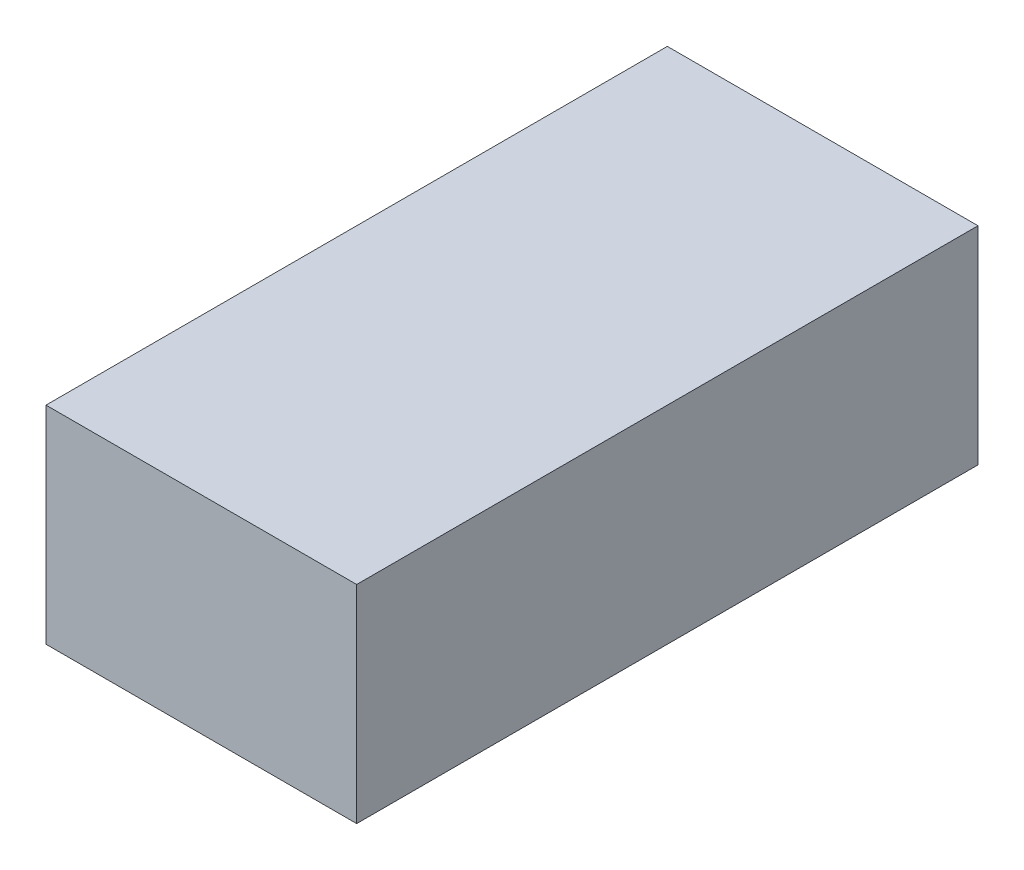
ISO-10303-21;
HEADER;
FILE_DESCRIPTION(('STEP AP214'),'2;1');
FILE_NAME('part.step','',(''),(''),'','','');
FILE_SCHEMA(('AUTOMOTIVE_DESIGN { 1 0 10303 214 1 1 1 1 }'));
ENDSEC;
DATA;
#1=APPLICATION_CONTEXT('core data for automotive mechanical design processes');
#2=APPLICATION_PROTOCOL_DEFINITION('international standard','automotive_design',2000,#1);
#3=PRODUCT_CONTEXT('',#1,'mechanical');
#4=PRODUCT('Part','Part','',(#3));
#5=PRODUCT_RELATED_PRODUCT_CATEGORY('part','',(#4));
#6=PRODUCT_DEFINITION_FORMATION('','',#4);
#7=PRODUCT_DEFINITION_CONTEXT('part definition',#1,'design');
#8=PRODUCT_DEFINITION('design','',#6,#7);
#9=PRODUCT_DEFINITION_SHAPE('','',#8);
#10=(LENGTH_UNIT() NAMED_UNIT(*) SI_UNIT(.MILLI.,.METRE.));
#11=(NAMED_UNIT(*) PLANE_ANGLE_UNIT() SI_UNIT($,.RADIAN.));
#12=(NAMED_UNIT(*) SI_UNIT($,.STERADIAN.) SOLID_ANGLE_UNIT());
#13=UNCERTAINTY_MEASURE_WITH_UNIT(LENGTH_MEASURE(1.E-05),#10,'distance_accuracy_value','');
#14=(GEOMETRIC_REPRESENTATION_CONTEXT(3) GLOBAL_UNCERTAINTY_ASSIGNED_CONTEXT((#13)) GLOBAL_UNIT_ASSIGNED_CONTEXT((#10,
#11,#12)) REPRESENTATION_CONTEXT('',''));
#15=CARTESIAN_POINT('',(0.,0.,0.));
#16=DIRECTION('',(0.,0.,1.));
#17=DIRECTION('',(1.,0.,0.));
#18=AXIS2_PLACEMENT_3D('',#15,#16,#17);
#19=CARTESIAN_POINT('',(-65.7209302325581,60.,88.3255813953488));
#20=DIRECTION('',(1.,0.,0.));
#21=DIRECTION('',(0.,0.,-1.));
#22=AXIS2_PLACEMENT_3D('',#19,#20,#21);
#23=PLANE('',#22);
#24=DIRECTION('',(0.,0.,1.));
#25=VECTOR('',#24,1.);
#26=CARTESIAN_POINT('',(-65.7209302325581,0.,88.3255813953488));
#27=LINE('',#26,#25);
#28=CARTESIAN_POINT('',(-65.7209302325581,0.,-91.6744186046512));
#29=VERTEX_POINT('',#28);
#30=CARTESIAN_POINT('',(-65.7209302325581,0.,88.3255813953488));
#31=VERTEX_POINT('',#30);
#32=EDGE_CURVE('E95',#29,#31,#27,.T.);
#33=ORIENTED_EDGE('',*,*,#32,.T.);
#34=DIRECTION('',(0.,-1.,0.));
#35=VECTOR('',#34,1.);
#36=CARTESIAN_POINT('',(-65.7209302325581,60.,88.3255813953488));
#37=LINE('',#36,#35);
#38=CARTESIAN_POINT('',(-65.7209302325581,60.,88.3255813953488));
#39=VERTEX_POINT('',#38);
#40=EDGE_CURVE('E11',#39,#31,#37,.T.);
#41=ORIENTED_EDGE('',*,*,#40,.F.);
#42=DIRECTION('',(0.,0.,1.));
#43=VECTOR('',#42,1.);
#44=CARTESIAN_POINT('',(-65.7209302325581,60.,88.3255813953488));
#45=LINE('',#44,#43);
#46=CARTESIAN_POINT('',(-65.7209302325581,60.,-91.6744186046512));
#47=VERTEX_POINT('',#46);
#48=EDGE_CURVE('E83',#47,#39,#45,.T.);
#49=ORIENTED_EDGE('',*,*,#48,.F.);
#50=DIRECTION('',(0.,-1.,0.));
#51=VECTOR('',#50,1.);
#52=CARTESIAN_POINT('',(-65.7209302325581,60.,-91.6744186046512));
#53=LINE('',#52,#51);
#54=EDGE_CURVE('E91',#47,#29,#53,.T.);
#55=ORIENTED_EDGE('',*,*,#54,.T.);
#56=EDGE_LOOP('',(#33,#41,#49,#55));
#57=FACE_BOUND('',#56,.T.);
#58=ADVANCED_FACE('F32',(#57),#23,.F.);
#59=CARTESIAN_POINT('',(-65.7209302325581,60.,88.3255813953488));
#60=DIRECTION('',(0.,0.,-1.));
#61=DIRECTION('',(-1.,0.,0.));
#62=AXIS2_PLACEMENT_3D('',#59,#60,#61);
#63=PLANE('',#62);
#64=DIRECTION('',(1.,0.,0.));
#65=VECTOR('',#64,1.);
#66=CARTESIAN_POINT('',(-65.7209302325581,0.,88.3255813953488));
#67=LINE('',#66,#65);
#68=CARTESIAN_POINT('',(24.2790697674419,0.,88.3255813953488));
#69=VERTEX_POINT('',#68);
#70=EDGE_CURVE('E87',#31,#69,#67,.T.);
#71=ORIENTED_EDGE('',*,*,#70,.T.);
#72=DIRECTION('',(0.,-1.,0.));
#73=VECTOR('',#72,1.);
#74=CARTESIAN_POINT('',(24.2790697674419,60.,88.3255813953488));
#75=LINE('',#74,#73);
#76=CARTESIAN_POINT('',(24.2790697674419,60.,88.3255813953488));
#77=VERTEX_POINT('',#76);
#78=EDGE_CURVE('E40',#77,#69,#75,.T.);
#79=ORIENTED_EDGE('',*,*,#78,.F.);
#80=DIRECTION('',(1.,0.,0.));
#81=VECTOR('',#80,1.);
#82=CARTESIAN_POINT('',(-65.7209302325581,60.,88.3255813953488));
#83=LINE('',#82,#81);
#84=EDGE_CURVE('E78',#39,#77,#83,.T.);
#85=ORIENTED_EDGE('',*,*,#84,.F.);
#86=ORIENTED_EDGE('',*,*,#40,.T.);
#87=EDGE_LOOP('',(#71,#79,#85,#86));
#88=FACE_BOUND('',#87,.T.);
#89=ADVANCED_FACE('F86',(#88),#63,.F.);
#90=CARTESIAN_POINT('',(24.2790697674419,60.,88.3255813953488));
#91=DIRECTION('',(-1.,0.,0.));
#92=DIRECTION('',(0.,0.,1.));
#93=AXIS2_PLACEMENT_3D('',#90,#91,#92);
#94=PLANE('',#93);
#95=DIRECTION('',(0.,0.,-1.));
#96=VECTOR('',#95,1.);
#97=CARTESIAN_POINT('',(24.2790697674419,0.,88.3255813953488));
#98=LINE('',#97,#96);
#99=CARTESIAN_POINT('',(24.2790697674419,0.,-91.6744186046512));
#100=VERTEX_POINT('',#99);
#101=EDGE_CURVE('E65',#69,#100,#98,.T.);
#102=ORIENTED_EDGE('',*,*,#101,.T.);
#103=DIRECTION('',(0.,-1.,0.));
#104=VECTOR('',#103,1.);
#105=CARTESIAN_POINT('',(24.2790697674419,60.,-91.6744186046512));
#106=LINE('',#105,#104);
#107=CARTESIAN_POINT('',(24.2790697674419,60.,-91.6744186046512));
#108=VERTEX_POINT('',#107);
#109=EDGE_CURVE('E88',#108,#100,#106,.T.);
#110=ORIENTED_EDGE('',*,*,#109,.F.);
#111=DIRECTION('',(0.,0.,-1.));
#112=VECTOR('',#111,1.);
#113=CARTESIAN_POINT('',(24.2790697674419,60.,88.3255813953488));
#114=LINE('',#113,#112);
#115=EDGE_CURVE('E81',#77,#108,#114,.T.);
#116=ORIENTED_EDGE('',*,*,#115,.F.);
#117=ORIENTED_EDGE('',*,*,#78,.T.);
#118=EDGE_LOOP('',(#102,#110,#116,#117));
#119=FACE_BOUND('',#118,.T.);
#120=ADVANCED_FACE('F89',(#119),#94,.F.);
#121=CARTESIAN_POINT('',(-65.7209302325581,60.,-91.6744186046512));
#122=DIRECTION('',(0.,0.,1.));
#123=DIRECTION('',(1.,0.,0.));
#124=AXIS2_PLACEMENT_3D('',#121,#122,#123);
#125=PLANE('',#124);
#126=DIRECTION('',(-1.,0.,0.));
#127=VECTOR('',#126,1.);
#128=CARTESIAN_POINT('',(-65.7209302325581,0.,-91.6744186046512));
#129=LINE('',#128,#127);
#130=EDGE_CURVE('E71',#100,#29,#129,.T.);
#131=ORIENTED_EDGE('',*,*,#130,.T.);
#132=ORIENTED_EDGE('',*,*,#54,.F.);
#133=DIRECTION('',(-1.,0.,0.));
#134=VECTOR('',#133,1.);
#135=CARTESIAN_POINT('',(-65.7209302325581,60.,-91.6744186046512));
#136=LINE('',#135,#134);
#137=EDGE_CURVE('E48',#108,#47,#136,.T.);
#138=ORIENTED_EDGE('',*,*,#137,.F.);
#139=ORIENTED_EDGE('',*,*,#109,.T.);
#140=EDGE_LOOP('',(#131,#132,#138,#139));
#141=FACE_BOUND('',#140,.T.);
#142=ADVANCED_FACE('F102',(#141),#125,.F.);
#143=CARTESIAN_POINT('',(0.,60.,0.));
#144=DIRECTION('',(0.,-1.,0.));
#145=DIRECTION('',(0.,0.,-1.));
#146=AXIS2_PLACEMENT_3D('',#143,#144,#145);
#147=PLANE('',#146);
#148=ORIENTED_EDGE('',*,*,#48,.T.);
#149=ORIENTED_EDGE('',*,*,#84,.T.);
#150=ORIENTED_EDGE('',*,*,#115,.T.);
#151=ORIENTED_EDGE('',*,*,#137,.T.);
#152=EDGE_LOOP('',(#148,#149,#150,#151));
#153=FACE_BOUND('',#152,.T.);
#154=ADVANCED_FACE('F79',(#153),#147,.F.);
#155=CARTESIAN_POINT('',(0.,0.,0.));
#156=DIRECTION('',(0.,-1.,0.));
#157=DIRECTION('',(0.,0.,-1.));
#158=AXIS2_PLACEMENT_3D('',#155,#156,#157);
#159=PLANE('',#158);
#160=ORIENTED_EDGE('',*,*,#32,.F.);
#161=ORIENTED_EDGE('',*,*,#130,.F.);
#162=ORIENTED_EDGE('',*,*,#101,.F.);
#163=ORIENTED_EDGE('',*,*,#70,.F.);
#164=EDGE_LOOP('',(#160,#161,#162,#163));
#165=FACE_BOUND('',#164,.T.);
#166=ADVANCED_FACE('F105',(#165),#159,.T.);
#167=CLOSED_SHELL('',(#58,#89,#120,#142,#154,#166));
#168=MANIFOLD_SOLID_BREP('B2',#167);
#169=ADVANCED_BREP_SHAPE_REPRESENTATION('',(#18,#168),#14);
#170=SHAPE_DEFINITION_REPRESENTATION(#9,#169);
ENDSEC;
END-ISO-10303-21;
